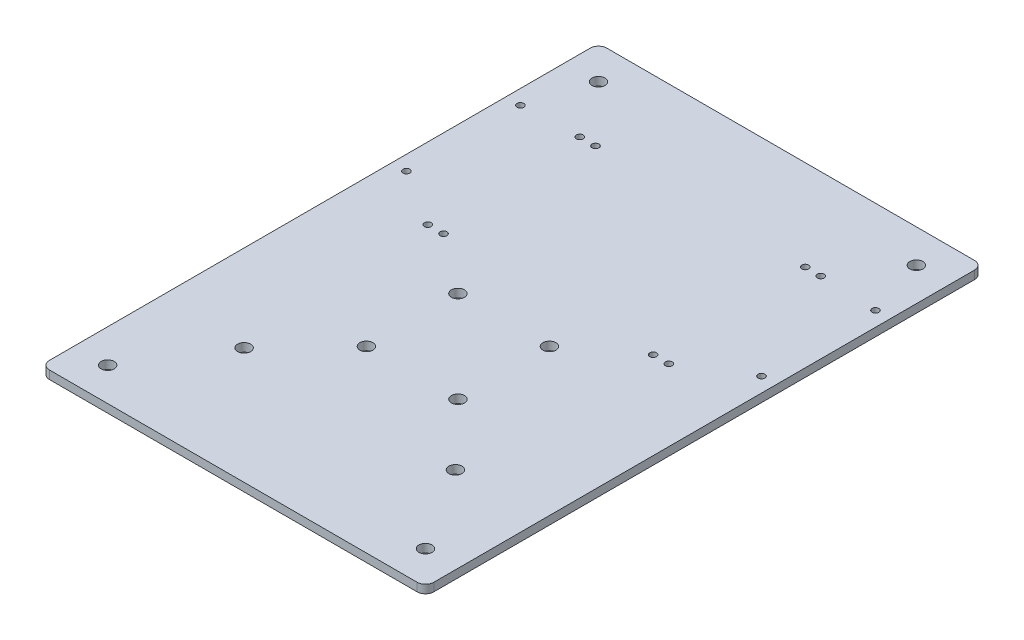
ISO-10303-21;
HEADER;
FILE_DESCRIPTION(('STEP AP214'),'2;1');
FILE_NAME('part.step','',(''),(''),'','','');
FILE_SCHEMA(('AUTOMOTIVE_DESIGN { 1 0 10303 214 1 1 1 1 }'));
ENDSEC;
DATA;
#1=APPLICATION_CONTEXT('core data for automotive mechanical design processes');
#2=APPLICATION_PROTOCOL_DEFINITION('international standard','automotive_design',2000,#1);
#3=PRODUCT_CONTEXT('',#1,'mechanical');
#4=PRODUCT('Part','Part','',(#3));
#5=PRODUCT_RELATED_PRODUCT_CATEGORY('part','',(#4));
#6=PRODUCT_DEFINITION_FORMATION('','',#4);
#7=PRODUCT_DEFINITION_CONTEXT('part definition',#1,'design');
#8=PRODUCT_DEFINITION('design','',#6,#7);
#9=PRODUCT_DEFINITION_SHAPE('','',#8);
#10=(LENGTH_UNIT() NAMED_UNIT(*) SI_UNIT(.MILLI.,.METRE.));
#11=(NAMED_UNIT(*) PLANE_ANGLE_UNIT() SI_UNIT($,.RADIAN.));
#12=(NAMED_UNIT(*) SI_UNIT($,.STERADIAN.) SOLID_ANGLE_UNIT());
#13=UNCERTAINTY_MEASURE_WITH_UNIT(LENGTH_MEASURE(1.E-05),#10,'distance_accuracy_value','');
#14=(GEOMETRIC_REPRESENTATION_CONTEXT(3) GLOBAL_UNCERTAINTY_ASSIGNED_CONTEXT((#13)) GLOBAL_UNIT_ASSIGNED_CONTEXT((#10,
#11,#12)) REPRESENTATION_CONTEXT('',''));
#15=CARTESIAN_POINT('',(0.,0.,0.));
#16=DIRECTION('',(0.,0.,1.));
#17=DIRECTION('',(1.,0.,0.));
#18=AXIS2_PLACEMENT_3D('',#15,#16,#17);
#19=CARTESIAN_POINT('',(0.,1.5875,0.));
#20=DIRECTION('',(0.,-1.,0.));
#21=DIRECTION('',(0.,0.,-1.));
#22=AXIS2_PLACEMENT_3D('',#19,#20,#21);
#23=PLANE('',#22);
#24=CARTESIAN_POINT('',(-17.4625,1.5875,38.1));
#25=DIRECTION('',(0.,1.,0.));
#26=DIRECTION('',(0.,0.,1.));
#27=AXIS2_PLACEMENT_3D('',#24,#25,#26);
#28=CIRCLE('',#27,2.4892);
#29=CARTESIAN_POINT('',(-17.4625,1.5875,40.5892));
#30=VERTEX_POINT('',#29);
#31=EDGE_CURVE('E294',#30,#30,#28,.T.);
#32=ORIENTED_EDGE('',*,*,#31,.F.);
#33=EDGE_LOOP('',(#32));
#34=FACE_BOUND('',#33,.T.);
#35=CARTESIAN_POINT('',(-17.4625,1.5875,3.17500000000001));
#36=DIRECTION('',(0.,1.,0.));
#37=DIRECTION('',(0.,0.,1.));
#38=AXIS2_PLACEMENT_3D('',#35,#36,#37);
#39=CIRCLE('',#38,2.4892);
#40=CARTESIAN_POINT('',(-17.4625,1.5875,5.66420000000001));
#41=VERTEX_POINT('',#40);
#42=EDGE_CURVE('E300',#41,#41,#39,.T.);
#43=ORIENTED_EDGE('',*,*,#42,.F.);
#44=EDGE_LOOP('',(#43));
#45=FACE_BOUND('',#44,.T.);
#46=CARTESIAN_POINT('',(17.4625,1.5875,3.175));
#47=DIRECTION('',(0.,1.,0.));
#48=DIRECTION('',(0.,0.,1.));
#49=AXIS2_PLACEMENT_3D('',#46,#47,#48);
#50=CIRCLE('',#49,2.4892);
#51=CARTESIAN_POINT('',(17.4625,1.5875,5.6642));
#52=VERTEX_POINT('',#51);
#53=EDGE_CURVE('E288',#52,#52,#50,.T.);
#54=ORIENTED_EDGE('',*,*,#53,.F.);
#55=EDGE_LOOP('',(#54));
#56=FACE_BOUND('',#55,.T.);
#57=CARTESIAN_POINT('',(17.4625,1.5875,38.1));
#58=DIRECTION('',(0.,1.,0.));
#59=DIRECTION('',(0.,0.,1.));
#60=AXIS2_PLACEMENT_3D('',#57,#58,#59);
#61=CIRCLE('',#60,2.4892);
#62=CARTESIAN_POINT('',(17.4625,1.5875,40.5892));
#63=VERTEX_POINT('',#62);
#64=EDGE_CURVE('E277',#63,#63,#61,.T.);
#65=ORIENTED_EDGE('',*,*,#64,.F.);
#66=EDGE_LOOP('',(#65));
#67=FACE_BOUND('',#66,.T.);
#68=CARTESIAN_POINT('',(-40.3225,1.5875,61.9125));
#69=DIRECTION('',(0.,1.,0.));
#70=DIRECTION('',(0.,0.,1.));
#71=AXIS2_PLACEMENT_3D('',#68,#69,#70);
#72=CIRCLE('',#71,2.4892);
#73=CARTESIAN_POINT('',(-40.3225,1.5875,64.4017));
#74=VERTEX_POINT('',#73);
#75=EDGE_CURVE('E280',#74,#74,#72,.T.);
#76=ORIENTED_EDGE('',*,*,#75,.F.);
#77=EDGE_LOOP('',(#76));
#78=FACE_BOUND('',#77,.T.);
#79=CARTESIAN_POINT('',(40.3225,1.5875,61.9125));
#80=DIRECTION('',(0.,1.,0.));
#81=DIRECTION('',(0.,0.,1.));
#82=AXIS2_PLACEMENT_3D('',#79,#80,#81);
#83=CIRCLE('',#82,2.4892);
#84=CARTESIAN_POINT('',(40.3225,1.5875,64.4017));
#85=VERTEX_POINT('',#84);
#86=EDGE_CURVE('E273',#85,#85,#83,.T.);
#87=ORIENTED_EDGE('',*,*,#86,.F.);
#88=EDGE_LOOP('',(#87));
#89=FACE_BOUND('',#88,.T.);
#90=CARTESIAN_POINT('',(67.75,1.5875,-70.962500061));
#91=DIRECTION('',(0.,1.,0.));
#92=DIRECTION('',(0.,0.,1.));
#93=AXIS2_PLACEMENT_3D('',#90,#91,#92);
#94=CIRCLE('',#93,1.29999999999999);
#95=CARTESIAN_POINT('',(67.75,1.5875,-69.662500061));
#96=VERTEX_POINT('',#95);
#97=EDGE_CURVE('E262',#96,#96,#94,.T.);
#98=ORIENTED_EDGE('',*,*,#97,.F.);
#99=EDGE_LOOP('',(#98));
#100=FACE_BOUND('',#99,.T.);
#101=CARTESIAN_POINT('',(-67.75,1.5875,-27.462499939));
#102=DIRECTION('',(0.,1.,0.));
#103=DIRECTION('',(0.,0.,1.));
#104=AXIS2_PLACEMENT_3D('',#101,#102,#103);
#105=CIRCLE('',#104,1.29999999999999);
#106=CARTESIAN_POINT('',(-67.75,1.5875,-26.162499939));
#107=VERTEX_POINT('',#106);
#108=EDGE_CURVE('E255',#107,#107,#105,.T.);
#109=ORIENTED_EDGE('',*,*,#108,.F.);
#110=EDGE_LOOP('',(#109));
#111=FACE_BOUND('',#110,.T.);
#112=CARTESIAN_POINT('',(67.75,1.5875,-27.462499939));
#113=DIRECTION('',(0.,1.,0.));
#114=DIRECTION('',(0.,0.,1.));
#115=AXIS2_PLACEMENT_3D('',#112,#113,#114);
#116=CIRCLE('',#115,1.29999999999999);
#117=CARTESIAN_POINT('',(67.75,1.5875,-26.162499939));
#118=VERTEX_POINT('',#117);
#119=EDGE_CURVE('E267',#118,#118,#116,.T.);
#120=ORIENTED_EDGE('',*,*,#119,.F.);
#121=EDGE_LOOP('',(#120));
#122=FACE_BOUND('',#121,.T.);
#123=CARTESIAN_POINT('',(-67.75,1.5875,-70.962500061));
#124=DIRECTION('',(0.,1.,0.));
#125=DIRECTION('',(0.,0.,1.));
#126=AXIS2_PLACEMENT_3D('',#123,#124,#125);
#127=CIRCLE('',#126,1.29999999999999);
#128=CARTESIAN_POINT('',(-67.75,1.5875,-69.662500061));
#129=VERTEX_POINT('',#128);
#130=EDGE_CURVE('E249',#129,#129,#127,.T.);
#131=ORIENTED_EDGE('',*,*,#130,.F.);
#132=EDGE_LOOP('',(#131));
#133=FACE_BOUND('',#132,.T.);
#134=CARTESIAN_POINT('',(40.,1.5875,-71.8625));
#135=DIRECTION('',(0.,1.,0.));
#136=DIRECTION('',(0.,0.,1.));
#137=AXIS2_PLACEMENT_3D('',#134,#135,#136);
#138=CIRCLE('',#137,1.3);
#139=CARTESIAN_POINT('',(40.,1.5875,-70.5625));
#140=VERTEX_POINT('',#139);
#141=EDGE_CURVE('E204',#140,#140,#138,.T.);
#142=ORIENTED_EDGE('',*,*,#141,.F.);
#143=EDGE_LOOP('',(#142));
#144=FACE_BOUND('',#143,.T.);
#145=CARTESIAN_POINT('',(-46.,1.5875,-71.8625));
#146=DIRECTION('',(0.,1.,0.));
#147=DIRECTION('',(0.,0.,1.));
#148=AXIS2_PLACEMENT_3D('',#145,#146,#147);
#149=CIRCLE('',#148,1.3);
#150=CARTESIAN_POINT('',(-46.,1.5875,-70.5625));
#151=VERTEX_POINT('',#150);
#152=EDGE_CURVE('E223',#151,#151,#149,.T.);
#153=ORIENTED_EDGE('',*,*,#152,.F.);
#154=EDGE_LOOP('',(#153));
#155=FACE_BOUND('',#154,.T.);
#156=CARTESIAN_POINT('',(-46.,1.5875,-13.8625));
#157=DIRECTION('',(0.,1.,0.));
#158=DIRECTION('',(0.,0.,1.));
#159=AXIS2_PLACEMENT_3D('',#156,#157,#158);
#160=CIRCLE('',#159,1.3);
#161=CARTESIAN_POINT('',(-46.,1.5875,-12.5625));
#162=VERTEX_POINT('',#161);
#163=EDGE_CURVE('E217',#162,#162,#160,.T.);
#164=ORIENTED_EDGE('',*,*,#163,.F.);
#165=EDGE_LOOP('',(#164));
#166=FACE_BOUND('',#165,.T.);
#167=CARTESIAN_POINT('',(46.,1.5875,-13.8625));
#168=DIRECTION('',(0.,1.,0.));
#169=DIRECTION('',(0.,0.,1.));
#170=AXIS2_PLACEMENT_3D('',#167,#168,#169);
#171=CIRCLE('',#170,1.3);
#172=CARTESIAN_POINT('',(46.,1.5875,-12.5625));
#173=VERTEX_POINT('',#172);
#174=EDGE_CURVE('E210',#173,#173,#171,.T.);
#175=ORIENTED_EDGE('',*,*,#174,.F.);
#176=EDGE_LOOP('',(#175));
#177=FACE_BOUND('',#176,.T.);
#178=CARTESIAN_POINT('',(46.,1.5875,-71.8625));
#179=DIRECTION('',(0.,1.,0.));
#180=DIRECTION('',(0.,0.,1.));
#181=AXIS2_PLACEMENT_3D('',#178,#179,#180);
#182=CIRCLE('',#181,1.3);
#183=CARTESIAN_POINT('',(46.,1.5875,-70.5625));
#184=VERTEX_POINT('',#183);
#185=EDGE_CURVE('E211',#184,#184,#182,.T.);
#186=ORIENTED_EDGE('',*,*,#185,.F.);
#187=EDGE_LOOP('',(#186));
#188=FACE_BOUND('',#187,.T.);
#189=CARTESIAN_POINT('',(-40.,1.5875,-71.8625));
#190=DIRECTION('',(0.,1.,0.));
#191=DIRECTION('',(0.,0.,1.));
#192=AXIS2_PLACEMENT_3D('',#189,#190,#191);
#193=CIRCLE('',#192,1.3);
#194=CARTESIAN_POINT('',(-40.,1.5875,-70.5625));
#195=VERTEX_POINT('',#194);
#196=EDGE_CURVE('E241',#195,#195,#193,.T.);
#197=ORIENTED_EDGE('',*,*,#196,.F.);
#198=EDGE_LOOP('',(#197));
#199=FACE_BOUND('',#198,.T.);
#200=CARTESIAN_POINT('',(-40.,1.5875,-13.8625));
#201=DIRECTION('',(0.,1.,0.));
#202=DIRECTION('',(0.,0.,1.));
#203=AXIS2_PLACEMENT_3D('',#200,#201,#202);
#204=CIRCLE('',#203,1.3);
#205=CARTESIAN_POINT('',(-40.,1.5875,-12.5625));
#206=VERTEX_POINT('',#205);
#207=EDGE_CURVE('E234',#206,#206,#204,.T.);
#208=ORIENTED_EDGE('',*,*,#207,.F.);
#209=EDGE_LOOP('',(#208));
#210=FACE_BOUND('',#209,.T.);
#211=CARTESIAN_POINT('',(40.,1.5875,-13.8625));
#212=DIRECTION('',(0.,1.,0.));
#213=DIRECTION('',(0.,0.,1.));
#214=AXIS2_PLACEMENT_3D('',#211,#212,#213);
#215=CIRCLE('',#214,1.3);
#216=CARTESIAN_POINT('',(40.,1.5875,-12.5625));
#217=VERTEX_POINT('',#216);
#218=EDGE_CURVE('E201',#217,#217,#215,.T.);
#219=ORIENTED_EDGE('',*,*,#218,.F.);
#220=EDGE_LOOP('',(#219));
#221=FACE_BOUND('',#220,.T.);
#222=DIRECTION('',(0.,0.,1.));
#223=VECTOR('',#222,1.);
#224=CARTESIAN_POINT('',(-73.3425,1.5875,106.3625));
#225=LINE('',#224,#223);
#226=CARTESIAN_POINT('',(-73.3425,1.5875,-103.1875));
#227=VERTEX_POINT('',#226);
#228=CARTESIAN_POINT('',(-73.3425,1.5875,103.1875));
#229=VERTEX_POINT('',#228);
#230=EDGE_CURVE('E176',#227,#229,#225,.T.);
#231=ORIENTED_EDGE('',*,*,#230,.T.);
#232=CARTESIAN_POINT('',(-70.1675,1.5875,103.1875));
#233=DIRECTION('',(0.,-1.,0.));
#234=DIRECTION('',(0.,0.,-1.));
#235=AXIS2_PLACEMENT_3D('',#232,#233,#234);
#236=CIRCLE('',#235,3.175);
#237=CARTESIAN_POINT('',(-70.1675,1.5875,106.3625));
#238=VERTEX_POINT('',#237);
#239=EDGE_CURVE('E153',#229,#238,#236,.F.);
#240=ORIENTED_EDGE('',*,*,#239,.T.);
#241=DIRECTION('',(1.,0.,0.));
#242=VECTOR('',#241,1.);
#243=CARTESIAN_POINT('',(-73.3425,1.5875,106.3625));
#244=LINE('',#243,#242);
#245=CARTESIAN_POINT('',(70.1675,1.5875,106.3625));
#246=VERTEX_POINT('',#245);
#247=EDGE_CURVE('E124',#238,#246,#244,.T.);
#248=ORIENTED_EDGE('',*,*,#247,.T.);
#249=CARTESIAN_POINT('',(70.1675,1.5875,103.1875));
#250=DIRECTION('',(0.,-1.,0.));
#251=DIRECTION('',(0.,0.,-1.));
#252=AXIS2_PLACEMENT_3D('',#249,#250,#251);
#253=CIRCLE('',#252,3.175);
#254=CARTESIAN_POINT('',(73.3425,1.5875,103.1875));
#255=VERTEX_POINT('',#254);
#256=EDGE_CURVE('E148',#246,#255,#253,.F.);
#257=ORIENTED_EDGE('',*,*,#256,.T.);
#258=DIRECTION('',(0.,0.,-1.));
#259=VECTOR('',#258,1.);
#260=CARTESIAN_POINT('',(73.3425,1.5875,106.3625));
#261=LINE('',#260,#259);
#262=CARTESIAN_POINT('',(73.3425,1.5875,-103.1875));
#263=VERTEX_POINT('',#262);
#264=EDGE_CURVE('E131',#255,#263,#261,.T.);
#265=ORIENTED_EDGE('',*,*,#264,.T.);
#266=CARTESIAN_POINT('',(70.1675,1.5875,-103.1875));
#267=DIRECTION('',(0.,-1.,0.));
#268=DIRECTION('',(0.,0.,-1.));
#269=AXIS2_PLACEMENT_3D('',#266,#267,#268);
#270=CIRCLE('',#269,3.175);
#271=CARTESIAN_POINT('',(70.1675,1.5875,-106.3625));
#272=VERTEX_POINT('',#271);
#273=EDGE_CURVE('E60',#263,#272,#270,.F.);
#274=ORIENTED_EDGE('',*,*,#273,.T.);
#275=DIRECTION('',(-1.,0.,0.));
#276=VECTOR('',#275,1.);
#277=CARTESIAN_POINT('',(-73.3425,1.5875,-106.3625));
#278=LINE('',#277,#276);
#279=CARTESIAN_POINT('',(-70.1675,1.5875,-106.3625));
#280=VERTEX_POINT('',#279);
#281=EDGE_CURVE('E134',#272,#280,#278,.T.);
#282=ORIENTED_EDGE('',*,*,#281,.T.);
#283=CARTESIAN_POINT('',(-70.1675,1.5875,-103.1875));
#284=DIRECTION('',(0.,-1.,0.));
#285=DIRECTION('',(0.,0.,-1.));
#286=AXIS2_PLACEMENT_3D('',#283,#284,#285);
#287=CIRCLE('',#286,3.175);
#288=EDGE_CURVE('E151',#280,#227,#287,.F.);
#289=ORIENTED_EDGE('',*,*,#288,.T.);
#290=EDGE_LOOP('',(#231,#240,#248,#257,#265,#274,#282,#289));
#291=FACE_BOUND('',#290,.T.);
#292=CARTESIAN_POINT('',(60.6425,1.5875,-93.6625));
#293=DIRECTION('',(0.,1.,0.));
#294=DIRECTION('',(0.,0.,1.));
#295=AXIS2_PLACEMENT_3D('',#292,#293,#294);
#296=CIRCLE('',#295,2.48920000000001);
#297=CARTESIAN_POINT('',(60.6425,1.5875,-91.1733));
#298=VERTEX_POINT('',#297);
#299=EDGE_CURVE('E169',#298,#298,#296,.T.);
#300=ORIENTED_EDGE('',*,*,#299,.F.);
#301=EDGE_LOOP('',(#300));
#302=FACE_BOUND('',#301,.T.);
#303=CARTESIAN_POINT('',(-60.6425,1.5875,-93.6625));
#304=DIRECTION('',(0.,1.,0.));
#305=DIRECTION('',(0.,0.,1.));
#306=AXIS2_PLACEMENT_3D('',#303,#304,#305);
#307=CIRCLE('',#306,2.4892);
#308=CARTESIAN_POINT('',(-60.6425,1.5875,-91.1733));
#309=VERTEX_POINT('',#308);
#310=EDGE_CURVE('E181',#309,#309,#307,.T.);
#311=ORIENTED_EDGE('',*,*,#310,.F.);
#312=EDGE_LOOP('',(#311));
#313=FACE_BOUND('',#312,.T.);
#314=CARTESIAN_POINT('',(60.6425,1.5875,93.6625));
#315=DIRECTION('',(0.,1.,0.));
#316=DIRECTION('',(0.,0.,1.));
#317=AXIS2_PLACEMENT_3D('',#314,#315,#316);
#318=CIRCLE('',#317,2.48920000000001);
#319=CARTESIAN_POINT('',(60.6425,1.5875,96.1517));
#320=VERTEX_POINT('',#319);
#321=EDGE_CURVE('E186',#320,#320,#318,.T.);
#322=ORIENTED_EDGE('',*,*,#321,.F.);
#323=EDGE_LOOP('',(#322));
#324=FACE_BOUND('',#323,.T.);
#325=CARTESIAN_POINT('',(-60.6425,1.5875,93.6625));
#326=DIRECTION('',(0.,1.,0.));
#327=DIRECTION('',(0.,0.,1.));
#328=AXIS2_PLACEMENT_3D('',#325,#326,#327);
#329=CIRCLE('',#328,2.4892);
#330=CARTESIAN_POINT('',(-60.6425,1.5875,96.1517));
#331=VERTEX_POINT('',#330);
#332=EDGE_CURVE('E192',#331,#331,#329,.T.);
#333=ORIENTED_EDGE('',*,*,#332,.F.);
#334=EDGE_LOOP('',(#333));
#335=FACE_BOUND('',#334,.T.);
#336=ADVANCED_FACE('F38',(#34,#45,#56,#67,#78,#89,#100,#111,#122,#133,#144,#155,#166,#177,#188,
#199,#210,#221,#291,#302,#313,#324,#335),#23,.F.);
#337=CARTESIAN_POINT('',(0.,-1.5875,0.));
#338=DIRECTION('',(0.,-1.,0.));
#339=DIRECTION('',(0.,0.,-1.));
#340=AXIS2_PLACEMENT_3D('',#337,#338,#339);
#341=PLANE('',#340);
#342=CARTESIAN_POINT('',(-17.4625,-1.5875,38.1));
#343=DIRECTION('',(0.,-1.,0.));
#344=DIRECTION('',(0.,0.,-1.));
#345=AXIS2_PLACEMENT_3D('',#342,#343,#344);
#346=CIRCLE('',#345,2.4892);
#347=CARTESIAN_POINT('',(-17.4625,-1.5875,35.6108));
#348=VERTEX_POINT('',#347);
#349=EDGE_CURVE('E291',#348,#348,#346,.F.);
#350=ORIENTED_EDGE('',*,*,#349,.T.);
#351=EDGE_LOOP('',(#350));
#352=FACE_BOUND('',#351,.T.);
#353=CARTESIAN_POINT('',(-17.4625,-1.5875,3.17500000000001));
#354=DIRECTION('',(0.,-1.,0.));
#355=DIRECTION('',(0.,0.,-1.));
#356=AXIS2_PLACEMENT_3D('',#353,#354,#355);
#357=CIRCLE('',#356,2.4892);
#358=CARTESIAN_POINT('',(-17.4625,-1.5875,0.685800000000008));
#359=VERTEX_POINT('',#358);
#360=EDGE_CURVE('E297',#359,#359,#357,.F.);
#361=ORIENTED_EDGE('',*,*,#360,.T.);
#362=EDGE_LOOP('',(#361));
#363=FACE_BOUND('',#362,.T.);
#364=CARTESIAN_POINT('',(17.4625,-1.5875,3.175));
#365=DIRECTION('',(0.,-1.,0.));
#366=DIRECTION('',(0.,0.,-1.));
#367=AXIS2_PLACEMENT_3D('',#364,#365,#366);
#368=CIRCLE('',#367,2.4892);
#369=CARTESIAN_POINT('',(17.4625,-1.5875,0.685800000000004));
#370=VERTEX_POINT('',#369);
#371=EDGE_CURVE('E303',#370,#370,#368,.F.);
#372=ORIENTED_EDGE('',*,*,#371,.T.);
#373=EDGE_LOOP('',(#372));
#374=FACE_BOUND('',#373,.T.);
#375=CARTESIAN_POINT('',(17.4625,-1.5875,38.1));
#376=DIRECTION('',(0.,-1.,0.));
#377=DIRECTION('',(0.,0.,-1.));
#378=AXIS2_PLACEMENT_3D('',#375,#376,#377);
#379=CIRCLE('',#378,2.4892);
#380=CARTESIAN_POINT('',(17.4625,-1.5875,35.6108));
#381=VERTEX_POINT('',#380);
#382=EDGE_CURVE('E285',#381,#381,#379,.F.);
#383=ORIENTED_EDGE('',*,*,#382,.T.);
#384=EDGE_LOOP('',(#383));
#385=FACE_BOUND('',#384,.T.);
#386=CARTESIAN_POINT('',(-40.3225,-1.5875,61.9125));
#387=DIRECTION('',(0.,1.,0.));
#388=DIRECTION('',(0.,0.,1.));
#389=AXIS2_PLACEMENT_3D('',#386,#387,#388);
#390=CIRCLE('',#389,2.4892);
#391=CARTESIAN_POINT('',(-40.3225,-1.5875,64.4017));
#392=VERTEX_POINT('',#391);
#393=EDGE_CURVE('E270',#392,#392,#390,.T.);
#394=ORIENTED_EDGE('',*,*,#393,.T.);
#395=EDGE_LOOP('',(#394));
#396=FACE_BOUND('',#395,.T.);
#397=CARTESIAN_POINT('',(40.3225,-1.5875,61.9125));
#398=DIRECTION('',(0.,1.,0.));
#399=DIRECTION('',(0.,0.,1.));
#400=AXIS2_PLACEMENT_3D('',#397,#398,#399);
#401=CIRCLE('',#400,2.4892);
#402=CARTESIAN_POINT('',(40.3225,-1.5875,64.4017));
#403=VERTEX_POINT('',#402);
#404=EDGE_CURVE('E276',#403,#403,#401,.T.);
#405=ORIENTED_EDGE('',*,*,#404,.T.);
#406=EDGE_LOOP('',(#405));
#407=FACE_BOUND('',#406,.T.);
#408=CARTESIAN_POINT('',(67.75,-1.5875,-70.962500061));
#409=DIRECTION('',(0.,1.,0.));
#410=DIRECTION('',(0.,0.,1.));
#411=AXIS2_PLACEMENT_3D('',#408,#409,#410);
#412=CIRCLE('',#411,1.29999999999999);
#413=CARTESIAN_POINT('',(67.75,-1.5875,-69.662500061));
#414=VERTEX_POINT('',#413);
#415=EDGE_CURVE('E252',#414,#414,#412,.T.);
#416=ORIENTED_EDGE('',*,*,#415,.T.);
#417=EDGE_LOOP('',(#416));
#418=FACE_BOUND('',#417,.T.);
#419=CARTESIAN_POINT('',(-67.75,-1.5875,-27.462499939));
#420=DIRECTION('',(0.,1.,0.));
#421=DIRECTION('',(0.,0.,1.));
#422=AXIS2_PLACEMENT_3D('',#419,#420,#421);
#423=CIRCLE('',#422,1.29999999999999);
#424=CARTESIAN_POINT('',(-67.75,-1.5875,-26.162499939));
#425=VERTEX_POINT('',#424);
#426=EDGE_CURVE('E258',#425,#425,#423,.T.);
#427=ORIENTED_EDGE('',*,*,#426,.T.);
#428=EDGE_LOOP('',(#427));
#429=FACE_BOUND('',#428,.T.);
#430=CARTESIAN_POINT('',(67.75,-1.5875,-27.462499939));
#431=DIRECTION('',(0.,1.,0.));
#432=DIRECTION('',(0.,0.,1.));
#433=AXIS2_PLACEMENT_3D('',#430,#431,#432);
#434=CIRCLE('',#433,1.29999999999999);
#435=CARTESIAN_POINT('',(67.75,-1.5875,-26.162499939));
#436=VERTEX_POINT('',#435);
#437=EDGE_CURVE('E259',#436,#436,#434,.T.);
#438=ORIENTED_EDGE('',*,*,#437,.T.);
#439=EDGE_LOOP('',(#438));
#440=FACE_BOUND('',#439,.T.);
#441=CARTESIAN_POINT('',(-67.75,-1.5875,-70.962500061));
#442=DIRECTION('',(0.,1.,0.));
#443=DIRECTION('',(0.,0.,1.));
#444=AXIS2_PLACEMENT_3D('',#441,#442,#443);
#445=CIRCLE('',#444,1.29999999999999);
#446=CARTESIAN_POINT('',(-67.75,-1.5875,-69.662500061));
#447=VERTEX_POINT('',#446);
#448=EDGE_CURVE('E235',#447,#447,#445,.T.);
#449=ORIENTED_EDGE('',*,*,#448,.T.);
#450=EDGE_LOOP('',(#449));
#451=FACE_BOUND('',#450,.T.);
#452=CARTESIAN_POINT('',(40.,-1.5875,-71.8625));
#453=DIRECTION('',(0.,1.,0.));
#454=DIRECTION('',(0.,0.,1.));
#455=AXIS2_PLACEMENT_3D('',#452,#453,#454);
#456=CIRCLE('',#455,1.3);
#457=CARTESIAN_POINT('',(40.,-1.5875,-70.5625));
#458=VERTEX_POINT('',#457);
#459=EDGE_CURVE('E226',#458,#458,#456,.T.);
#460=ORIENTED_EDGE('',*,*,#459,.T.);
#461=EDGE_LOOP('',(#460));
#462=FACE_BOUND('',#461,.T.);
#463=CARTESIAN_POINT('',(-46.,-1.5875,-71.8625));
#464=DIRECTION('',(0.,1.,0.));
#465=DIRECTION('',(0.,0.,1.));
#466=AXIS2_PLACEMENT_3D('',#463,#464,#465);
#467=CIRCLE('',#466,1.3);
#468=CARTESIAN_POINT('',(-46.,-1.5875,-70.5625));
#469=VERTEX_POINT('',#468);
#470=EDGE_CURVE('E220',#469,#469,#467,.T.);
#471=ORIENTED_EDGE('',*,*,#470,.T.);
#472=EDGE_LOOP('',(#471));
#473=FACE_BOUND('',#472,.T.);
#474=CARTESIAN_POINT('',(-46.,-1.5875,-13.8625));
#475=DIRECTION('',(0.,1.,0.));
#476=DIRECTION('',(0.,0.,1.));
#477=AXIS2_PLACEMENT_3D('',#474,#475,#476);
#478=CIRCLE('',#477,1.3);
#479=CARTESIAN_POINT('',(-46.,-1.5875,-12.5625));
#480=VERTEX_POINT('',#479);
#481=EDGE_CURVE('E214',#480,#480,#478,.T.);
#482=ORIENTED_EDGE('',*,*,#481,.T.);
#483=EDGE_LOOP('',(#482));
#484=FACE_BOUND('',#483,.T.);
#485=CARTESIAN_POINT('',(46.,-1.5875,-13.8625));
#486=DIRECTION('',(0.,1.,0.));
#487=DIRECTION('',(0.,0.,1.));
#488=AXIS2_PLACEMENT_3D('',#485,#486,#487);
#489=CIRCLE('',#488,1.3);
#490=CARTESIAN_POINT('',(46.,-1.5875,-12.5625));
#491=VERTEX_POINT('',#490);
#492=EDGE_CURVE('E207',#491,#491,#489,.T.);
#493=ORIENTED_EDGE('',*,*,#492,.T.);
#494=EDGE_LOOP('',(#493));
#495=FACE_BOUND('',#494,.T.);
#496=CARTESIAN_POINT('',(46.,-1.5875,-71.8625));
#497=DIRECTION('',(0.,1.,0.));
#498=DIRECTION('',(0.,0.,1.));
#499=AXIS2_PLACEMENT_3D('',#496,#497,#498);
#500=CIRCLE('',#499,1.3);
#501=CARTESIAN_POINT('',(46.,-1.5875,-70.5625));
#502=VERTEX_POINT('',#501);
#503=EDGE_CURVE('E244',#502,#502,#500,.T.);
#504=ORIENTED_EDGE('',*,*,#503,.T.);
#505=EDGE_LOOP('',(#504));
#506=FACE_BOUND('',#505,.T.);
#507=CARTESIAN_POINT('',(-40.,-1.5875,-71.8625));
#508=DIRECTION('',(0.,1.,0.));
#509=DIRECTION('',(0.,0.,1.));
#510=AXIS2_PLACEMENT_3D('',#507,#508,#509);
#511=CIRCLE('',#510,1.3);
#512=CARTESIAN_POINT('',(-40.,-1.5875,-70.5625));
#513=VERTEX_POINT('',#512);
#514=EDGE_CURVE('E238',#513,#513,#511,.T.);
#515=ORIENTED_EDGE('',*,*,#514,.T.);
#516=EDGE_LOOP('',(#515));
#517=FACE_BOUND('',#516,.T.);
#518=CARTESIAN_POINT('',(-40.,-1.5875,-13.8625));
#519=DIRECTION('',(0.,1.,0.));
#520=DIRECTION('',(0.,0.,1.));
#521=AXIS2_PLACEMENT_3D('',#518,#519,#520);
#522=CIRCLE('',#521,1.3);
#523=CARTESIAN_POINT('',(-40.,-1.5875,-12.5625));
#524=VERTEX_POINT('',#523);
#525=EDGE_CURVE('E231',#524,#524,#522,.T.);
#526=ORIENTED_EDGE('',*,*,#525,.T.);
#527=EDGE_LOOP('',(#526));
#528=FACE_BOUND('',#527,.T.);
#529=CARTESIAN_POINT('',(40.,-1.5875,-13.8625));
#530=DIRECTION('',(0.,1.,0.));
#531=DIRECTION('',(0.,0.,1.));
#532=AXIS2_PLACEMENT_3D('',#529,#530,#531);
#533=CIRCLE('',#532,1.3);
#534=CARTESIAN_POINT('',(40.,-1.5875,-12.5625));
#535=VERTEX_POINT('',#534);
#536=EDGE_CURVE('E198',#535,#535,#533,.T.);
#537=ORIENTED_EDGE('',*,*,#536,.T.);
#538=EDGE_LOOP('',(#537));
#539=FACE_BOUND('',#538,.T.);
#540=CARTESIAN_POINT('',(60.6425,-1.5875,93.6625));
#541=DIRECTION('',(0.,1.,0.));
#542=DIRECTION('',(0.,0.,1.));
#543=AXIS2_PLACEMENT_3D('',#540,#541,#542);
#544=CIRCLE('',#543,2.48920000000001);
#545=CARTESIAN_POINT('',(60.6425,-1.5875,96.1517));
#546=VERTEX_POINT('',#545);
#547=EDGE_CURVE('E189',#546,#546,#544,.T.);
#548=ORIENTED_EDGE('',*,*,#547,.T.);
#549=EDGE_LOOP('',(#548));
#550=FACE_BOUND('',#549,.T.);
#551=CARTESIAN_POINT('',(60.6425,-1.5875,-93.6625));
#552=DIRECTION('',(0.,1.,0.));
#553=DIRECTION('',(0.,0.,1.));
#554=AXIS2_PLACEMENT_3D('',#551,#552,#553);
#555=CIRCLE('',#554,2.48920000000001);
#556=CARTESIAN_POINT('',(60.6425,-1.5875,-91.1733));
#557=VERTEX_POINT('',#556);
#558=EDGE_CURVE('E172',#557,#557,#555,.T.);
#559=ORIENTED_EDGE('',*,*,#558,.T.);
#560=EDGE_LOOP('',(#559));
#561=FACE_BOUND('',#560,.T.);
#562=DIRECTION('',(1.,0.,0.));
#563=VECTOR('',#562,1.);
#564=CARTESIAN_POINT('',(-73.3425,-1.5875,106.3625));
#565=LINE('',#564,#563);
#566=CARTESIAN_POINT('',(-70.1675,-1.5875,106.3625));
#567=VERTEX_POINT('',#566);
#568=CARTESIAN_POINT('',(70.1675,-1.5875,106.3625));
#569=VERTEX_POINT('',#568);
#570=EDGE_CURVE('E121',#567,#569,#565,.T.);
#571=ORIENTED_EDGE('',*,*,#570,.F.);
#572=CARTESIAN_POINT('',(-70.1675,-1.5875,103.1875));
#573=DIRECTION('',(0.,-1.,0.));
#574=DIRECTION('',(0.,0.,-1.));
#575=AXIS2_PLACEMENT_3D('',#572,#573,#574);
#576=CIRCLE('',#575,3.175);
#577=CARTESIAN_POINT('',(-73.3425,-1.5875,103.1875));
#578=VERTEX_POINT('',#577);
#579=EDGE_CURVE('E104',#567,#578,#576,.T.);
#580=ORIENTED_EDGE('',*,*,#579,.T.);
#581=DIRECTION('',(0.,0.,1.));
#582=VECTOR('',#581,1.);
#583=CARTESIAN_POINT('',(-73.3425,-1.5875,106.3625));
#584=LINE('',#583,#582);
#585=CARTESIAN_POINT('',(-73.3425,-1.5875,-103.1875));
#586=VERTEX_POINT('',#585);
#587=EDGE_CURVE('E132',#586,#578,#584,.T.);
#588=ORIENTED_EDGE('',*,*,#587,.F.);
#589=CARTESIAN_POINT('',(-70.1675,-1.5875,-103.1875));
#590=DIRECTION('',(0.,-1.,0.));
#591=DIRECTION('',(0.,0.,-1.));
#592=AXIS2_PLACEMENT_3D('',#589,#590,#591);
#593=CIRCLE('',#592,3.175);
#594=CARTESIAN_POINT('',(-70.1675,-1.5875,-106.3625));
#595=VERTEX_POINT('',#594);
#596=EDGE_CURVE('E115',#586,#595,#593,.T.);
#597=ORIENTED_EDGE('',*,*,#596,.T.);
#598=DIRECTION('',(-1.,0.,0.));
#599=VECTOR('',#598,1.);
#600=CARTESIAN_POINT('',(-73.3425,-1.5875,-106.3625));
#601=LINE('',#600,#599);
#602=CARTESIAN_POINT('',(70.1675,-1.5875,-106.3625));
#603=VERTEX_POINT('',#602);
#604=EDGE_CURVE('E136',#603,#595,#601,.T.);
#605=ORIENTED_EDGE('',*,*,#604,.F.);
#606=CARTESIAN_POINT('',(70.1675,-1.5875,-103.1875));
#607=DIRECTION('',(0.,-1.,0.));
#608=DIRECTION('',(0.,0.,-1.));
#609=AXIS2_PLACEMENT_3D('',#606,#607,#608);
#610=CIRCLE('',#609,3.175);
#611=CARTESIAN_POINT('',(73.3425,-1.5875,-103.1875));
#612=VERTEX_POINT('',#611);
#613=EDGE_CURVE('E142',#603,#612,#610,.T.);
#614=ORIENTED_EDGE('',*,*,#613,.T.);
#615=DIRECTION('',(0.,0.,-1.));
#616=VECTOR('',#615,1.);
#617=CARTESIAN_POINT('',(73.3425,-1.5875,106.3625));
#618=LINE('',#617,#616);
#619=CARTESIAN_POINT('',(73.3425,-1.5875,103.1875));
#620=VERTEX_POINT('',#619);
#621=EDGE_CURVE('E164',#620,#612,#618,.T.);
#622=ORIENTED_EDGE('',*,*,#621,.F.);
#623=CARTESIAN_POINT('',(70.1675,-1.5875,103.1875));
#624=DIRECTION('',(0.,-1.,0.));
#625=DIRECTION('',(0.,0.,-1.));
#626=AXIS2_PLACEMENT_3D('',#623,#624,#625);
#627=CIRCLE('',#626,3.175);
#628=EDGE_CURVE('E125',#620,#569,#627,.T.);
#629=ORIENTED_EDGE('',*,*,#628,.T.);
#630=EDGE_LOOP('',(#571,#580,#588,#597,#605,#614,#622,#629));
#631=FACE_BOUND('',#630,.T.);
#632=CARTESIAN_POINT('',(-60.6425,-1.5875,-93.6625));
#633=DIRECTION('',(0.,1.,0.));
#634=DIRECTION('',(0.,0.,1.));
#635=AXIS2_PLACEMENT_3D('',#632,#633,#634);
#636=CIRCLE('',#635,2.4892);
#637=CARTESIAN_POINT('',(-60.6425,-1.5875,-91.1733));
#638=VERTEX_POINT('',#637);
#639=EDGE_CURVE('E183',#638,#638,#636,.T.);
#640=ORIENTED_EDGE('',*,*,#639,.T.);
#641=EDGE_LOOP('',(#640));
#642=FACE_BOUND('',#641,.T.);
#643=CARTESIAN_POINT('',(-60.6425,-1.5875,93.6625));
#644=DIRECTION('',(0.,1.,0.));
#645=DIRECTION('',(0.,0.,1.));
#646=AXIS2_PLACEMENT_3D('',#643,#644,#645);
#647=CIRCLE('',#646,2.4892);
#648=CARTESIAN_POINT('',(-60.6425,-1.5875,96.1517));
#649=VERTEX_POINT('',#648);
#650=EDGE_CURVE('E195',#649,#649,#647,.T.);
#651=ORIENTED_EDGE('',*,*,#650,.T.);
#652=EDGE_LOOP('',(#651));
#653=FACE_BOUND('',#652,.T.);
#654=ADVANCED_FACE('F128',(#352,#363,#374,#385,#396,#407,#418,#429,#440,#451,#462,#473,#484,
#495,#506,#517,#528,#539,#550,#561,#631,#642,#653),#341,.T.);
#655=CARTESIAN_POINT('',(73.3425,1.5875,106.3625));
#656=DIRECTION('',(-1.,0.,0.));
#657=DIRECTION('',(0.,0.,1.));
#658=AXIS2_PLACEMENT_3D('',#655,#656,#657);
#659=PLANE('',#658);
#660=ORIENTED_EDGE('',*,*,#621,.T.);
#661=DIRECTION('',(0.,-1.,0.));
#662=VECTOR('',#661,1.);
#663=CARTESIAN_POINT('',(73.3425,1.5875,-103.1875));
#664=LINE('',#663,#662);
#665=EDGE_CURVE('E11',#612,#263,#664,.F.);
#666=ORIENTED_EDGE('',*,*,#665,.T.);
#667=ORIENTED_EDGE('',*,*,#264,.F.);
#668=DIRECTION('',(0.,-1.,0.));
#669=VECTOR('',#668,1.);
#670=CARTESIAN_POINT('',(73.3425,1.5875,103.1875));
#671=LINE('',#670,#669);
#672=EDGE_CURVE('E46',#255,#620,#671,.T.);
#673=ORIENTED_EDGE('',*,*,#672,.T.);
#674=EDGE_LOOP('',(#660,#666,#667,#673));
#675=FACE_BOUND('',#674,.T.);
#676=ADVANCED_FACE('F163',(#675),#659,.F.);
#677=CARTESIAN_POINT('',(-73.3425,1.5875,-106.3625));
#678=DIRECTION('',(0.,0.,1.));
#679=DIRECTION('',(1.,0.,0.));
#680=AXIS2_PLACEMENT_3D('',#677,#678,#679);
#681=PLANE('',#680);
#682=ORIENTED_EDGE('',*,*,#604,.T.);
#683=DIRECTION('',(0.,-1.,0.));
#684=VECTOR('',#683,1.);
#685=CARTESIAN_POINT('',(-70.1675,1.5875,-106.3625));
#686=LINE('',#685,#684);
#687=EDGE_CURVE('E53',#595,#280,#686,.F.);
#688=ORIENTED_EDGE('',*,*,#687,.T.);
#689=ORIENTED_EDGE('',*,*,#281,.F.);
#690=DIRECTION('',(0.,-1.,0.));
#691=VECTOR('',#690,1.);
#692=CARTESIAN_POINT('',(70.1675,1.5875,-106.3625));
#693=LINE('',#692,#691);
#694=EDGE_CURVE('E155',#272,#603,#693,.T.);
#695=ORIENTED_EDGE('',*,*,#694,.T.);
#696=EDGE_LOOP('',(#682,#688,#689,#695));
#697=FACE_BOUND('',#696,.T.);
#698=ADVANCED_FACE('F367',(#697),#681,.F.);
#699=CARTESIAN_POINT('',(-73.3425,1.5875,106.3625));
#700=DIRECTION('',(1.,0.,0.));
#701=DIRECTION('',(0.,0.,-1.));
#702=AXIS2_PLACEMENT_3D('',#699,#700,#701);
#703=PLANE('',#702);
#704=ORIENTED_EDGE('',*,*,#587,.T.);
#705=DIRECTION('',(0.,-1.,0.));
#706=VECTOR('',#705,1.);
#707=CARTESIAN_POINT('',(-73.3425,1.5875,103.1875));
#708=LINE('',#707,#706);
#709=EDGE_CURVE('E109',#578,#229,#708,.F.);
#710=ORIENTED_EDGE('',*,*,#709,.T.);
#711=ORIENTED_EDGE('',*,*,#230,.F.);
#712=DIRECTION('',(0.,-1.,0.));
#713=VECTOR('',#712,1.);
#714=CARTESIAN_POINT('',(-73.3425,1.5875,-103.1875));
#715=LINE('',#714,#713);
#716=EDGE_CURVE('E114',#227,#586,#715,.T.);
#717=ORIENTED_EDGE('',*,*,#716,.T.);
#718=EDGE_LOOP('',(#704,#710,#711,#717));
#719=FACE_BOUND('',#718,.T.);
#720=ADVANCED_FACE('F375',(#719),#703,.F.);
#721=CARTESIAN_POINT('',(-73.3425,1.5875,106.3625));
#722=DIRECTION('',(0.,0.,-1.));
#723=DIRECTION('',(-1.,0.,0.));
#724=AXIS2_PLACEMENT_3D('',#721,#722,#723);
#725=PLANE('',#724);
#726=ORIENTED_EDGE('',*,*,#247,.F.);
#727=DIRECTION('',(0.,-1.,0.));
#728=VECTOR('',#727,1.);
#729=CARTESIAN_POINT('',(-70.1675,1.5875,106.3625));
#730=LINE('',#729,#728);
#731=EDGE_CURVE('E108',#238,#567,#730,.T.);
#732=ORIENTED_EDGE('',*,*,#731,.T.);
#733=ORIENTED_EDGE('',*,*,#570,.T.);
#734=DIRECTION('',(0.,-1.,0.));
#735=VECTOR('',#734,1.);
#736=CARTESIAN_POINT('',(70.1675,1.5875,106.3625));
#737=LINE('',#736,#735);
#738=EDGE_CURVE('E126',#569,#246,#737,.F.);
#739=ORIENTED_EDGE('',*,*,#738,.T.);
#740=EDGE_LOOP('',(#726,#732,#733,#739));
#741=FACE_BOUND('',#740,.T.);
#742=ADVANCED_FACE('F120',(#741),#725,.F.);
#743=CARTESIAN_POINT('',(60.6425,1.5875,-93.6625));
#744=DIRECTION('',(0.,-1.,0.));
#745=DIRECTION('',(0.,0.,-1.));
#746=AXIS2_PLACEMENT_3D('',#743,#744,#745);
#747=CYLINDRICAL_SURFACE('',#746,2.48920000000001);
#748=ORIENTED_EDGE('',*,*,#299,.T.);
#749=EDGE_LOOP('',(#748));
#750=FACE_BOUND('',#749,.T.);
#751=ORIENTED_EDGE('',*,*,#558,.F.);
#752=EDGE_LOOP('',(#751));
#753=FACE_BOUND('',#752,.T.);
#754=ADVANCED_FACE('F374',(#750,#753),#747,.F.);
#755=CARTESIAN_POINT('',(-60.6425,1.5875,-93.6625));
#756=DIRECTION('',(0.,-1.,0.));
#757=DIRECTION('',(0.,0.,-1.));
#758=AXIS2_PLACEMENT_3D('',#755,#756,#757);
#759=CYLINDRICAL_SURFACE('',#758,2.4892);
#760=ORIENTED_EDGE('',*,*,#310,.T.);
#761=EDGE_LOOP('',(#760));
#762=FACE_BOUND('',#761,.T.);
#763=ORIENTED_EDGE('',*,*,#639,.F.);
#764=EDGE_LOOP('',(#763));
#765=FACE_BOUND('',#764,.T.);
#766=ADVANCED_FACE('F416',(#762,#765),#759,.F.);
#767=CARTESIAN_POINT('',(60.6425,1.5875,93.6625));
#768=DIRECTION('',(0.,-1.,0.));
#769=DIRECTION('',(0.,0.,-1.));
#770=AXIS2_PLACEMENT_3D('',#767,#768,#769);
#771=CYLINDRICAL_SURFACE('',#770,2.48920000000001);
#772=ORIENTED_EDGE('',*,*,#321,.T.);
#773=EDGE_LOOP('',(#772));
#774=FACE_BOUND('',#773,.T.);
#775=ORIENTED_EDGE('',*,*,#547,.F.);
#776=EDGE_LOOP('',(#775));
#777=FACE_BOUND('',#776,.T.);
#778=ADVANCED_FACE('F357',(#774,#777),#771,.F.);
#779=CARTESIAN_POINT('',(-60.6425,1.5875,93.6625));
#780=DIRECTION('',(0.,-1.,0.));
#781=DIRECTION('',(0.,0.,-1.));
#782=AXIS2_PLACEMENT_3D('',#779,#780,#781);
#783=CYLINDRICAL_SURFACE('',#782,2.4892);
#784=ORIENTED_EDGE('',*,*,#332,.T.);
#785=EDGE_LOOP('',(#784));
#786=FACE_BOUND('',#785,.T.);
#787=ORIENTED_EDGE('',*,*,#650,.F.);
#788=EDGE_LOOP('',(#787));
#789=FACE_BOUND('',#788,.T.);
#790=ADVANCED_FACE('F354',(#786,#789),#783,.F.);
#791=CARTESIAN_POINT('',(-70.1675,1.5875,103.1875));
#792=DIRECTION('',(0.,-1.,0.));
#793=DIRECTION('',(0.,0.,-1.));
#794=AXIS2_PLACEMENT_3D('',#791,#792,#793);
#795=CYLINDRICAL_SURFACE('',#794,3.175);
#796=ORIENTED_EDGE('',*,*,#239,.F.);
#797=ORIENTED_EDGE('',*,*,#709,.F.);
#798=ORIENTED_EDGE('',*,*,#579,.F.);
#799=ORIENTED_EDGE('',*,*,#731,.F.);
#800=EDGE_LOOP('',(#796,#797,#798,#799));
#801=FACE_BOUND('',#800,.T.);
#802=ADVANCED_FACE('F107',(#801),#795,.T.);
#803=CARTESIAN_POINT('',(-70.1675,1.5875,-103.1875));
#804=DIRECTION('',(0.,-1.,0.));
#805=DIRECTION('',(0.,0.,-1.));
#806=AXIS2_PLACEMENT_3D('',#803,#804,#805);
#807=CYLINDRICAL_SURFACE('',#806,3.175);
#808=ORIENTED_EDGE('',*,*,#288,.F.);
#809=ORIENTED_EDGE('',*,*,#687,.F.);
#810=ORIENTED_EDGE('',*,*,#596,.F.);
#811=ORIENTED_EDGE('',*,*,#716,.F.);
#812=EDGE_LOOP('',(#808,#809,#810,#811));
#813=FACE_BOUND('',#812,.T.);
#814=ADVANCED_FACE('F383',(#813),#807,.T.);
#815=CARTESIAN_POINT('',(70.1675,1.5875,-103.1875));
#816=DIRECTION('',(0.,-1.,0.));
#817=DIRECTION('',(0.,0.,-1.));
#818=AXIS2_PLACEMENT_3D('',#815,#816,#817);
#819=CYLINDRICAL_SURFACE('',#818,3.175);
#820=ORIENTED_EDGE('',*,*,#273,.F.);
#821=ORIENTED_EDGE('',*,*,#665,.F.);
#822=ORIENTED_EDGE('',*,*,#613,.F.);
#823=ORIENTED_EDGE('',*,*,#694,.F.);
#824=EDGE_LOOP('',(#820,#821,#822,#823));
#825=FACE_BOUND('',#824,.T.);
#826=ADVANCED_FACE('F385',(#825),#819,.T.);
#827=CARTESIAN_POINT('',(70.1675,1.5875,103.1875));
#828=DIRECTION('',(0.,-1.,0.));
#829=DIRECTION('',(0.,0.,-1.));
#830=AXIS2_PLACEMENT_3D('',#827,#828,#829);
#831=CYLINDRICAL_SURFACE('',#830,3.175);
#832=ORIENTED_EDGE('',*,*,#256,.F.);
#833=ORIENTED_EDGE('',*,*,#738,.F.);
#834=ORIENTED_EDGE('',*,*,#628,.F.);
#835=ORIENTED_EDGE('',*,*,#672,.F.);
#836=EDGE_LOOP('',(#832,#833,#834,#835));
#837=FACE_BOUND('',#836,.T.);
#838=ADVANCED_FACE('F40',(#837),#831,.T.);
#839=CARTESIAN_POINT('',(40.,-1.5875,-13.8625));
#840=DIRECTION('',(0.,1.,0.));
#841=DIRECTION('',(0.,0.,1.));
#842=AXIS2_PLACEMENT_3D('',#839,#840,#841);
#843=CYLINDRICAL_SURFACE('',#842,1.3);
#844=ORIENTED_EDGE('',*,*,#536,.F.);
#845=EDGE_LOOP('',(#844));
#846=FACE_BOUND('',#845,.T.);
#847=ORIENTED_EDGE('',*,*,#218,.T.);
#848=EDGE_LOOP('',(#847));
#849=FACE_BOUND('',#848,.T.);
#850=ADVANCED_FACE('F392',(#846,#849),#843,.F.);
#851=CARTESIAN_POINT('',(-40.,-1.5875,-13.8625));
#852=DIRECTION('',(0.,1.,0.));
#853=DIRECTION('',(0.,0.,1.));
#854=AXIS2_PLACEMENT_3D('',#851,#852,#853);
#855=CYLINDRICAL_SURFACE('',#854,1.3);
#856=ORIENTED_EDGE('',*,*,#525,.F.);
#857=EDGE_LOOP('',(#856));
#858=FACE_BOUND('',#857,.T.);
#859=ORIENTED_EDGE('',*,*,#207,.T.);
#860=EDGE_LOOP('',(#859));
#861=FACE_BOUND('',#860,.T.);
#862=ADVANCED_FACE('F399',(#858,#861),#855,.F.);
#863=CARTESIAN_POINT('',(-40.,-1.5875,-71.8625));
#864=DIRECTION('',(0.,1.,0.));
#865=DIRECTION('',(0.,0.,1.));
#866=AXIS2_PLACEMENT_3D('',#863,#864,#865);
#867=CYLINDRICAL_SURFACE('',#866,1.3);
#868=ORIENTED_EDGE('',*,*,#514,.F.);
#869=EDGE_LOOP('',(#868));
#870=FACE_BOUND('',#869,.T.);
#871=ORIENTED_EDGE('',*,*,#196,.T.);
#872=EDGE_LOOP('',(#871));
#873=FACE_BOUND('',#872,.T.);
#874=ADVANCED_FACE('F405',(#870,#873),#867,.F.);
#875=CARTESIAN_POINT('',(46.,-1.5875,-71.8625));
#876=DIRECTION('',(0.,1.,0.));
#877=DIRECTION('',(0.,0.,1.));
#878=AXIS2_PLACEMENT_3D('',#875,#876,#877);
#879=CYLINDRICAL_SURFACE('',#878,1.3);
#880=ORIENTED_EDGE('',*,*,#503,.F.);
#881=EDGE_LOOP('',(#880));
#882=FACE_BOUND('',#881,.T.);
#883=ORIENTED_EDGE('',*,*,#185,.T.);
#884=EDGE_LOOP('',(#883));
#885=FACE_BOUND('',#884,.T.);
#886=ADVANCED_FACE('F477',(#882,#885),#879,.F.);
#887=CARTESIAN_POINT('',(46.,-1.5875,-13.8625));
#888=DIRECTION('',(0.,1.,0.));
#889=DIRECTION('',(0.,0.,1.));
#890=AXIS2_PLACEMENT_3D('',#887,#888,#889);
#891=CYLINDRICAL_SURFACE('',#890,1.3);
#892=ORIENTED_EDGE('',*,*,#492,.F.);
#893=EDGE_LOOP('',(#892));
#894=FACE_BOUND('',#893,.T.);
#895=ORIENTED_EDGE('',*,*,#174,.T.);
#896=EDGE_LOOP('',(#895));
#897=FACE_BOUND('',#896,.T.);
#898=ADVANCED_FACE('F411',(#894,#897),#891,.F.);
#899=CARTESIAN_POINT('',(-46.,-1.5875,-13.8625));
#900=DIRECTION('',(0.,1.,0.));
#901=DIRECTION('',(0.,0.,1.));
#902=AXIS2_PLACEMENT_3D('',#899,#900,#901);
#903=CYLINDRICAL_SURFACE('',#902,1.3);
#904=ORIENTED_EDGE('',*,*,#481,.F.);
#905=EDGE_LOOP('',(#904));
#906=FACE_BOUND('',#905,.T.);
#907=ORIENTED_EDGE('',*,*,#163,.T.);
#908=EDGE_LOOP('',(#907));
#909=FACE_BOUND('',#908,.T.);
#910=ADVANCED_FACE('F496',(#906,#909),#903,.F.);
#911=CARTESIAN_POINT('',(-46.,-1.5875,-71.8625));
#912=DIRECTION('',(0.,1.,0.));
#913=DIRECTION('',(0.,0.,1.));
#914=AXIS2_PLACEMENT_3D('',#911,#912,#913);
#915=CYLINDRICAL_SURFACE('',#914,1.3);
#916=ORIENTED_EDGE('',*,*,#470,.F.);
#917=EDGE_LOOP('',(#916));
#918=FACE_BOUND('',#917,.T.);
#919=ORIENTED_EDGE('',*,*,#152,.T.);
#920=EDGE_LOOP('',(#919));
#921=FACE_BOUND('',#920,.T.);
#922=ADVANCED_FACE('F505',(#918,#921),#915,.F.);
#923=CARTESIAN_POINT('',(40.,-1.5875,-71.8625));
#924=DIRECTION('',(0.,1.,0.));
#925=DIRECTION('',(0.,0.,1.));
#926=AXIS2_PLACEMENT_3D('',#923,#924,#925);
#927=CYLINDRICAL_SURFACE('',#926,1.3);
#928=ORIENTED_EDGE('',*,*,#459,.F.);
#929=EDGE_LOOP('',(#928));
#930=FACE_BOUND('',#929,.T.);
#931=ORIENTED_EDGE('',*,*,#141,.T.);
#932=EDGE_LOOP('',(#931));
#933=FACE_BOUND('',#932,.T.);
#934=ADVANCED_FACE('F514',(#930,#933),#927,.F.);
#935=CARTESIAN_POINT('',(-67.75,-1.5875,-70.962500061));
#936=DIRECTION('',(0.,1.,0.));
#937=DIRECTION('',(0.,0.,1.));
#938=AXIS2_PLACEMENT_3D('',#935,#936,#937);
#939=CYLINDRICAL_SURFACE('',#938,1.29999999999999);
#940=ORIENTED_EDGE('',*,*,#448,.F.);
#941=EDGE_LOOP('',(#940));
#942=FACE_BOUND('',#941,.T.);
#943=ORIENTED_EDGE('',*,*,#130,.T.);
#944=EDGE_LOOP('',(#943));
#945=FACE_BOUND('',#944,.T.);
#946=ADVANCED_FACE('F524',(#942,#945),#939,.F.);
#947=CARTESIAN_POINT('',(67.75,-1.5875,-27.462499939));
#948=DIRECTION('',(0.,1.,0.));
#949=DIRECTION('',(0.,0.,1.));
#950=AXIS2_PLACEMENT_3D('',#947,#948,#949);
#951=CYLINDRICAL_SURFACE('',#950,1.29999999999999);
#952=ORIENTED_EDGE('',*,*,#437,.F.);
#953=EDGE_LOOP('',(#952));
#954=FACE_BOUND('',#953,.T.);
#955=ORIENTED_EDGE('',*,*,#119,.T.);
#956=EDGE_LOOP('',(#955));
#957=FACE_BOUND('',#956,.T.);
#958=ADVANCED_FACE('F534',(#954,#957),#951,.F.);
#959=CARTESIAN_POINT('',(-67.75,-1.5875,-27.462499939));
#960=DIRECTION('',(0.,1.,0.));
#961=DIRECTION('',(0.,0.,1.));
#962=AXIS2_PLACEMENT_3D('',#959,#960,#961);
#963=CYLINDRICAL_SURFACE('',#962,1.29999999999999);
#964=ORIENTED_EDGE('',*,*,#426,.F.);
#965=EDGE_LOOP('',(#964));
#966=FACE_BOUND('',#965,.T.);
#967=ORIENTED_EDGE('',*,*,#108,.T.);
#968=EDGE_LOOP('',(#967));
#969=FACE_BOUND('',#968,.T.);
#970=ADVANCED_FACE('F544',(#966,#969),#963,.F.);
#971=CARTESIAN_POINT('',(67.75,-1.5875,-70.962500061));
#972=DIRECTION('',(0.,1.,0.));
#973=DIRECTION('',(0.,0.,1.));
#974=AXIS2_PLACEMENT_3D('',#971,#972,#973);
#975=CYLINDRICAL_SURFACE('',#974,1.29999999999999);
#976=ORIENTED_EDGE('',*,*,#415,.F.);
#977=EDGE_LOOP('',(#976));
#978=FACE_BOUND('',#977,.T.);
#979=ORIENTED_EDGE('',*,*,#97,.T.);
#980=EDGE_LOOP('',(#979));
#981=FACE_BOUND('',#980,.T.);
#982=ADVANCED_FACE('F554',(#978,#981),#975,.F.);
#983=CARTESIAN_POINT('',(40.3225,-1.5875,61.9125));
#984=DIRECTION('',(0.,1.,0.));
#985=DIRECTION('',(0.,0.,1.));
#986=AXIS2_PLACEMENT_3D('',#983,#984,#985);
#987=CYLINDRICAL_SURFACE('',#986,2.4892);
#988=ORIENTED_EDGE('',*,*,#404,.F.);
#989=EDGE_LOOP('',(#988));
#990=FACE_BOUND('',#989,.T.);
#991=ORIENTED_EDGE('',*,*,#86,.T.);
#992=EDGE_LOOP('',(#991));
#993=FACE_BOUND('',#992,.T.);
#994=ADVANCED_FACE('F564',(#990,#993),#987,.F.);
#995=CARTESIAN_POINT('',(-40.3225,-1.5875,61.9125));
#996=DIRECTION('',(0.,1.,0.));
#997=DIRECTION('',(0.,0.,1.));
#998=AXIS2_PLACEMENT_3D('',#995,#996,#997);
#999=CYLINDRICAL_SURFACE('',#998,2.4892);
#1000=ORIENTED_EDGE('',*,*,#393,.F.);
#1001=EDGE_LOOP('',(#1000));
#1002=FACE_BOUND('',#1001,.T.);
#1003=ORIENTED_EDGE('',*,*,#75,.T.);
#1004=EDGE_LOOP('',(#1003));
#1005=FACE_BOUND('',#1004,.T.);
#1006=ADVANCED_FACE('F574',(#1002,#1005),#999,.F.);
#1007=CARTESIAN_POINT('',(17.4625,-1.5885,38.1));
#1008=DIRECTION('',(0.,1.,0.));
#1009=DIRECTION('',(0.,0.,1.));
#1010=AXIS2_PLACEMENT_3D('',#1007,#1008,#1009);
#1011=CYLINDRICAL_SURFACE('',#1010,2.4892);
#1012=ORIENTED_EDGE('',*,*,#382,.F.);
#1013=EDGE_LOOP('',(#1012));
#1014=FACE_BOUND('',#1013,.T.);
#1015=ORIENTED_EDGE('',*,*,#64,.T.);
#1016=EDGE_LOOP('',(#1015));
#1017=FACE_BOUND('',#1016,.T.);
#1018=ADVANCED_FACE('F584',(#1014,#1017),#1011,.F.);
#1019=CARTESIAN_POINT('',(17.4625,-1.5885,3.175));
#1020=DIRECTION('',(0.,1.,0.));
#1021=DIRECTION('',(0.,0.,1.));
#1022=AXIS2_PLACEMENT_3D('',#1019,#1020,#1021);
#1023=CYLINDRICAL_SURFACE('',#1022,2.4892);
#1024=ORIENTED_EDGE('',*,*,#371,.F.);
#1025=EDGE_LOOP('',(#1024));
#1026=FACE_BOUND('',#1025,.T.);
#1027=ORIENTED_EDGE('',*,*,#53,.T.);
#1028=EDGE_LOOP('',(#1027));
#1029=FACE_BOUND('',#1028,.T.);
#1030=ADVANCED_FACE('F309',(#1026,#1029),#1023,.F.);
#1031=CARTESIAN_POINT('',(-17.4625,-1.5885,3.17500000000001));
#1032=DIRECTION('',(0.,1.,0.));
#1033=DIRECTION('',(0.,0.,1.));
#1034=AXIS2_PLACEMENT_3D('',#1031,#1032,#1033);
#1035=CYLINDRICAL_SURFACE('',#1034,2.4892);
#1036=ORIENTED_EDGE('',*,*,#360,.F.);
#1037=EDGE_LOOP('',(#1036));
#1038=FACE_BOUND('',#1037,.T.);
#1039=ORIENTED_EDGE('',*,*,#42,.T.);
#1040=EDGE_LOOP('',(#1039));
#1041=FACE_BOUND('',#1040,.T.);
#1042=ADVANCED_FACE('F614',(#1038,#1041),#1035,.F.);
#1043=CARTESIAN_POINT('',(-17.4625,-1.5885,38.1));
#1044=DIRECTION('',(0.,1.,0.));
#1045=DIRECTION('',(0.,0.,1.));
#1046=AXIS2_PLACEMENT_3D('',#1043,#1044,#1045);
#1047=CYLINDRICAL_SURFACE('',#1046,2.4892);
#1048=ORIENTED_EDGE('',*,*,#349,.F.);
#1049=EDGE_LOOP('',(#1048));
#1050=FACE_BOUND('',#1049,.T.);
#1051=ORIENTED_EDGE('',*,*,#31,.T.);
#1052=EDGE_LOOP('',(#1051));
#1053=FACE_BOUND('',#1052,.T.);
#1054=ADVANCED_FACE('F624',(#1050,#1053),#1047,.F.);
#1055=CLOSED_SHELL('',(#336,#654,#676,#698,#720,#742,#754,#766,#778,#790,#802,#814,#826,#838,
#850,#862,#874,#886,#898,#910,#922,#934,#946,#958,#970,#982,#994,#1006,#1018,#1030,#1042,#1054));
#1056=MANIFOLD_SOLID_BREP('B2',#1055);
#1057=ADVANCED_BREP_SHAPE_REPRESENTATION('',(#18,#1056),#14);
#1058=SHAPE_DEFINITION_REPRESENTATION(#9,#1057);
ENDSEC;
END-ISO-10303-21;
